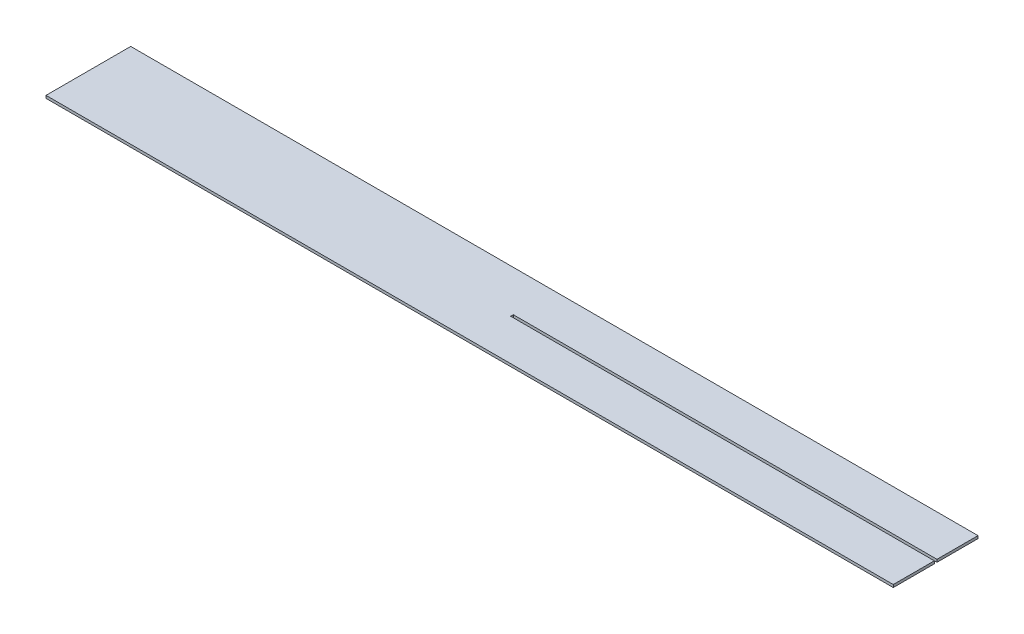
ISO-10303-21;
HEADER;
FILE_DESCRIPTION(('STEP AP214'),'2;1');
FILE_NAME('part.step','',(''),(''),'','','');
FILE_SCHEMA(('AUTOMOTIVE_DESIGN { 1 0 10303 214 1 1 1 1 }'));
ENDSEC;
DATA;
#1=APPLICATION_CONTEXT('core data for automotive mechanical design processes');
#2=APPLICATION_PROTOCOL_DEFINITION('international standard','automotive_design',2000,#1);
#3=PRODUCT_CONTEXT('',#1,'mechanical');
#4=PRODUCT('Part','Part','',(#3));
#5=PRODUCT_RELATED_PRODUCT_CATEGORY('part','',(#4));
#6=PRODUCT_DEFINITION_FORMATION('','',#4);
#7=PRODUCT_DEFINITION_CONTEXT('part definition',#1,'design');
#8=PRODUCT_DEFINITION('design','',#6,#7);
#9=PRODUCT_DEFINITION_SHAPE('','',#8);
#10=(LENGTH_UNIT() NAMED_UNIT(*) SI_UNIT(.MILLI.,.METRE.));
#11=(NAMED_UNIT(*) PLANE_ANGLE_UNIT() SI_UNIT($,.RADIAN.));
#12=(NAMED_UNIT(*) SI_UNIT($,.STERADIAN.) SOLID_ANGLE_UNIT());
#13=UNCERTAINTY_MEASURE_WITH_UNIT(LENGTH_MEASURE(1.E-05),#10,'distance_accuracy_value','');
#14=(GEOMETRIC_REPRESENTATION_CONTEXT(3) GLOBAL_UNCERTAINTY_ASSIGNED_CONTEXT((#13)) GLOBAL_UNIT_ASSIGNED_CONTEXT((#10,
#11,#12)) REPRESENTATION_CONTEXT('',''));
#15=CARTESIAN_POINT('',(0.,0.,0.));
#16=DIRECTION('',(0.,0.,1.));
#17=DIRECTION('',(1.,0.,0.));
#18=AXIS2_PLACEMENT_3D('',#15,#16,#17);
#19=CARTESIAN_POINT('',(0.,1.5875,0.793750000000075));
#20=DIRECTION('',(0.,0.,1.));
#21=DIRECTION('',(1.,0.,0.));
#22=AXIS2_PLACEMENT_3D('',#19,#20,#21);
#23=PLANE('',#22);
#24=DIRECTION('',(-1.,0.,0.));
#25=VECTOR('',#24,1.);
#26=CARTESIAN_POINT('',(0.,0.,0.793750000000075));
#27=LINE('',#26,#25);
#28=CARTESIAN_POINT('',(254.,0.,0.793750000000044));
#29=VERTEX_POINT('',#28);
#30=CARTESIAN_POINT('',(0.,0.,0.793750000000075));
#31=VERTEX_POINT('',#30);
#32=EDGE_CURVE('E136',#29,#31,#27,.T.);
#33=ORIENTED_EDGE('',*,*,#32,.T.);
#34=DIRECTION('',(0.,-1.,0.));
#35=VECTOR('',#34,1.);
#36=CARTESIAN_POINT('',(0.,1.5875,0.793750000000075));
#37=LINE('',#36,#35);
#38=CARTESIAN_POINT('',(0.,1.5875,0.793750000000075));
#39=VERTEX_POINT('',#38);
#40=EDGE_CURVE('E11',#39,#31,#37,.T.);
#41=ORIENTED_EDGE('',*,*,#40,.F.);
#42=DIRECTION('',(-1.,0.,0.));
#43=VECTOR('',#42,1.);
#44=CARTESIAN_POINT('',(0.,1.5875,0.793750000000075));
#45=LINE('',#44,#43);
#46=CARTESIAN_POINT('',(254.,1.5875,0.793750000000044));
#47=VERTEX_POINT('',#46);
#48=EDGE_CURVE('E178',#47,#39,#45,.T.);
#49=ORIENTED_EDGE('',*,*,#48,.F.);
#50=DIRECTION('',(0.,-1.,0.));
#51=VECTOR('',#50,1.);
#52=CARTESIAN_POINT('',(254.,1.5875,0.793750000000044));
#53=LINE('',#52,#51);
#54=EDGE_CURVE('E153',#47,#29,#53,.T.);
#55=ORIENTED_EDGE('',*,*,#54,.T.);
#56=EDGE_LOOP('',(#33,#41,#49,#55));
#57=FACE_BOUND('',#56,.T.);
#58=ADVANCED_FACE('F41',(#57),#23,.F.);
#59=CARTESIAN_POINT('',(0.,1.5875,0.));
#60=DIRECTION('',(-1.,0.,0.));
#61=DIRECTION('',(0.,0.,1.));
#62=AXIS2_PLACEMENT_3D('',#59,#60,#61);
#63=PLANE('',#62);
#64=DIRECTION('',(0.,0.,-1.));
#65=VECTOR('',#64,1.);
#66=CARTESIAN_POINT('',(0.,0.,0.));
#67=LINE('',#66,#65);
#68=CARTESIAN_POINT('',(0.,0.,-0.793749999999926));
#69=VERTEX_POINT('',#68);
#70=EDGE_CURVE('E139',#31,#69,#67,.T.);
#71=ORIENTED_EDGE('',*,*,#70,.T.);
#72=DIRECTION('',(0.,-1.,0.));
#73=VECTOR('',#72,1.);
#74=CARTESIAN_POINT('',(0.,1.5875,-0.793749999999926));
#75=LINE('',#74,#73);
#76=CARTESIAN_POINT('',(0.,1.5875,-0.793749999999926));
#77=VERTEX_POINT('',#76);
#78=EDGE_CURVE('E49',#77,#69,#75,.T.);
#79=ORIENTED_EDGE('',*,*,#78,.F.);
#80=DIRECTION('',(0.,0.,-1.));
#81=VECTOR('',#80,1.);
#82=CARTESIAN_POINT('',(0.,1.5875,0.));
#83=LINE('',#82,#81);
#84=EDGE_CURVE('E99',#39,#77,#83,.T.);
#85=ORIENTED_EDGE('',*,*,#84,.F.);
#86=ORIENTED_EDGE('',*,*,#40,.T.);
#87=EDGE_LOOP('',(#71,#79,#85,#86));
#88=FACE_BOUND('',#87,.T.);
#89=ADVANCED_FACE('F166',(#88),#63,.F.);
#90=CARTESIAN_POINT('',(0.,1.5875,-0.793749999999926));
#91=DIRECTION('',(0.,0.,1.));
#92=DIRECTION('',(1.,0.,0.));
#93=AXIS2_PLACEMENT_3D('',#90,#91,#92);
#94=PLANE('',#93);
#95=DIRECTION('',(-1.,0.,0.));
#96=VECTOR('',#95,1.);
#97=CARTESIAN_POINT('',(0.,0.,-0.793749999999926));
#98=LINE('',#97,#96);
#99=CARTESIAN_POINT('',(254.,0.,-0.793749999999957));
#100=VERTEX_POINT('',#99);
#101=EDGE_CURVE('E142',#100,#69,#98,.T.);
#102=ORIENTED_EDGE('',*,*,#101,.F.);
#103=DIRECTION('',(0.,-1.,0.));
#104=VECTOR('',#103,1.);
#105=CARTESIAN_POINT('',(254.,1.5875,-0.793749999999957));
#106=LINE('',#105,#104);
#107=CARTESIAN_POINT('',(254.,1.5875,-0.793749999999957));
#108=VERTEX_POINT('',#107);
#109=EDGE_CURVE('E159',#108,#100,#106,.T.);
#110=ORIENTED_EDGE('',*,*,#109,.F.);
#111=DIRECTION('',(-1.,0.,0.));
#112=VECTOR('',#111,1.);
#113=CARTESIAN_POINT('',(0.,1.5875,-0.793749999999926));
#114=LINE('',#113,#112);
#115=EDGE_CURVE('E165',#108,#77,#114,.T.);
#116=ORIENTED_EDGE('',*,*,#115,.T.);
#117=ORIENTED_EDGE('',*,*,#78,.T.);
#118=EDGE_LOOP('',(#102,#110,#116,#117));
#119=FACE_BOUND('',#118,.T.);
#120=ADVANCED_FACE('F163',(#119),#94,.T.);
#121=CARTESIAN_POINT('',(254.,1.5875,0.));
#122=DIRECTION('',(-1.,0.,0.));
#123=DIRECTION('',(0.,0.,1.));
#124=AXIS2_PLACEMENT_3D('',#121,#122,#123);
#125=PLANE('',#124);
#126=DIRECTION('',(0.,0.,-1.));
#127=VECTOR('',#126,1.);
#128=CARTESIAN_POINT('',(254.,0.,0.));
#129=LINE('',#128,#127);
#130=CARTESIAN_POINT('',(254.,0.,-25.4));
#131=VERTEX_POINT('',#130);
#132=EDGE_CURVE('E145',#100,#131,#129,.T.);
#133=ORIENTED_EDGE('',*,*,#132,.T.);
#134=DIRECTION('',(0.,-1.,0.));
#135=VECTOR('',#134,1.);
#136=CARTESIAN_POINT('',(254.,1.5875,-25.4));
#137=LINE('',#136,#135);
#138=CARTESIAN_POINT('',(254.,1.5875,-25.4));
#139=VERTEX_POINT('',#138);
#140=EDGE_CURVE('E157',#139,#131,#137,.T.);
#141=ORIENTED_EDGE('',*,*,#140,.F.);
#142=DIRECTION('',(0.,0.,-1.));
#143=VECTOR('',#142,1.);
#144=CARTESIAN_POINT('',(254.,1.5875,0.));
#145=LINE('',#144,#143);
#146=EDGE_CURVE('E132',#108,#139,#145,.T.);
#147=ORIENTED_EDGE('',*,*,#146,.F.);
#148=ORIENTED_EDGE('',*,*,#109,.T.);
#149=EDGE_LOOP('',(#133,#141,#147,#148));
#150=FACE_BOUND('',#149,.T.);
#151=ADVANCED_FACE('F175',(#150),#125,.F.);
#152=CARTESIAN_POINT('',(0.,1.5875,-25.4));
#153=DIRECTION('',(0.,0.,-1.));
#154=DIRECTION('',(-1.,0.,0.));
#155=AXIS2_PLACEMENT_3D('',#152,#153,#154);
#156=PLANE('',#155);
#157=DIRECTION('',(1.,0.,0.));
#158=VECTOR('',#157,1.);
#159=CARTESIAN_POINT('',(0.,0.,-25.4));
#160=LINE('',#159,#158);
#161=CARTESIAN_POINT('',(-254.,0.,-25.4));
#162=VERTEX_POINT('',#161);
#163=EDGE_CURVE('E148',#162,#131,#160,.T.);
#164=ORIENTED_EDGE('',*,*,#163,.F.);
#165=DIRECTION('',(0.,-1.,0.));
#166=VECTOR('',#165,1.);
#167=CARTESIAN_POINT('',(-254.,1.5875,-25.4));
#168=LINE('',#167,#166);
#169=CARTESIAN_POINT('',(-254.,1.5875,-25.4));
#170=VERTEX_POINT('',#169);
#171=EDGE_CURVE('E121',#170,#162,#168,.T.);
#172=ORIENTED_EDGE('',*,*,#171,.F.);
#173=DIRECTION('',(1.,0.,0.));
#174=VECTOR('',#173,1.);
#175=CARTESIAN_POINT('',(0.,1.5875,-25.4));
#176=LINE('',#175,#174);
#177=EDGE_CURVE('E130',#170,#139,#176,.T.);
#178=ORIENTED_EDGE('',*,*,#177,.T.);
#179=ORIENTED_EDGE('',*,*,#140,.T.);
#180=EDGE_LOOP('',(#164,#172,#178,#179));
#181=FACE_BOUND('',#180,.T.);
#182=ADVANCED_FACE('F194',(#181),#156,.T.);
#183=CARTESIAN_POINT('',(-254.,1.5875,0.));
#184=DIRECTION('',(-1.,0.,0.));
#185=DIRECTION('',(0.,0.,1.));
#186=AXIS2_PLACEMENT_3D('',#183,#184,#185);
#187=PLANE('',#186);
#188=DIRECTION('',(0.,0.,-1.));
#189=VECTOR('',#188,1.);
#190=CARTESIAN_POINT('',(-254.,0.,0.));
#191=LINE('',#190,#189);
#192=CARTESIAN_POINT('',(-254.,0.,25.4));
#193=VERTEX_POINT('',#192);
#194=EDGE_CURVE('E120',#193,#162,#191,.T.);
#195=ORIENTED_EDGE('',*,*,#194,.F.);
#196=DIRECTION('',(0.,-1.,0.));
#197=VECTOR('',#196,1.);
#198=CARTESIAN_POINT('',(-254.,1.5875,25.4));
#199=LINE('',#198,#197);
#200=CARTESIAN_POINT('',(-254.,1.5875,25.4));
#201=VERTEX_POINT('',#200);
#202=EDGE_CURVE('E114',#201,#193,#199,.T.);
#203=ORIENTED_EDGE('',*,*,#202,.F.);
#204=DIRECTION('',(0.,0.,-1.));
#205=VECTOR('',#204,1.);
#206=CARTESIAN_POINT('',(-254.,1.5875,0.));
#207=LINE('',#206,#205);
#208=EDGE_CURVE('E118',#201,#170,#207,.T.);
#209=ORIENTED_EDGE('',*,*,#208,.T.);
#210=ORIENTED_EDGE('',*,*,#171,.T.);
#211=EDGE_LOOP('',(#195,#203,#209,#210));
#212=FACE_BOUND('',#211,.T.);
#213=ADVANCED_FACE('F116',(#212),#187,.T.);
#214=CARTESIAN_POINT('',(0.,1.5875,25.4));
#215=DIRECTION('',(0.,0.,-1.));
#216=DIRECTION('',(-1.,0.,0.));
#217=AXIS2_PLACEMENT_3D('',#214,#215,#216);
#218=PLANE('',#217);
#219=DIRECTION('',(1.,0.,0.));
#220=VECTOR('',#219,1.);
#221=CARTESIAN_POINT('',(0.,0.,25.4));
#222=LINE('',#221,#220);
#223=CARTESIAN_POINT('',(254.,0.,25.4));
#224=VERTEX_POINT('',#223);
#225=EDGE_CURVE('E85',#193,#224,#222,.T.);
#226=ORIENTED_EDGE('',*,*,#225,.T.);
#227=DIRECTION('',(0.,-1.,0.));
#228=VECTOR('',#227,1.);
#229=CARTESIAN_POINT('',(254.,1.5875,25.4));
#230=LINE('',#229,#228);
#231=CARTESIAN_POINT('',(254.,1.5875,25.4));
#232=VERTEX_POINT('',#231);
#233=EDGE_CURVE('E122',#232,#224,#230,.T.);
#234=ORIENTED_EDGE('',*,*,#233,.F.);
#235=DIRECTION('',(1.,0.,0.));
#236=VECTOR('',#235,1.);
#237=CARTESIAN_POINT('',(0.,1.5875,25.4));
#238=LINE('',#237,#236);
#239=EDGE_CURVE('E124',#201,#232,#238,.T.);
#240=ORIENTED_EDGE('',*,*,#239,.F.);
#241=ORIENTED_EDGE('',*,*,#202,.T.);
#242=EDGE_LOOP('',(#226,#234,#240,#241));
#243=FACE_BOUND('',#242,.T.);
#244=ADVANCED_FACE('F125',(#243),#218,.F.);
#245=EDGE_CURVE('E91',#224,#29,#129,.T.);
#246=ORIENTED_EDGE('',*,*,#245,.T.);
#247=ORIENTED_EDGE('',*,*,#54,.F.);
#248=EDGE_CURVE('E57',#232,#47,#145,.T.);
#249=ORIENTED_EDGE('',*,*,#248,.F.);
#250=ORIENTED_EDGE('',*,*,#233,.T.);
#251=EDGE_LOOP('',(#246,#247,#249,#250));
#252=FACE_BOUND('',#251,.T.);
#253=ADVANCED_FACE('F183',(#252),#125,.F.);
#254=CARTESIAN_POINT('',(0.,1.5875,0.));
#255=DIRECTION('',(0.,1.,0.));
#256=DIRECTION('',(0.,0.,1.));
#257=AXIS2_PLACEMENT_3D('',#254,#255,#256);
#258=PLANE('',#257);
#259=ORIENTED_EDGE('',*,*,#48,.T.);
#260=ORIENTED_EDGE('',*,*,#84,.T.);
#261=ORIENTED_EDGE('',*,*,#115,.F.);
#262=ORIENTED_EDGE('',*,*,#146,.T.);
#263=ORIENTED_EDGE('',*,*,#177,.F.);
#264=ORIENTED_EDGE('',*,*,#208,.F.);
#265=ORIENTED_EDGE('',*,*,#239,.T.);
#266=ORIENTED_EDGE('',*,*,#248,.T.);
#267=EDGE_LOOP('',(#259,#260,#261,#262,#263,#264,#265,#266));
#268=FACE_BOUND('',#267,.T.);
#269=ADVANCED_FACE('F128',(#268),#258,.T.);
#270=CARTESIAN_POINT('',(0.,0.,0.));
#271=DIRECTION('',(0.,1.,0.));
#272=DIRECTION('',(0.,0.,1.));
#273=AXIS2_PLACEMENT_3D('',#270,#271,#272);
#274=PLANE('',#273);
#275=ORIENTED_EDGE('',*,*,#32,.F.);
#276=ORIENTED_EDGE('',*,*,#245,.F.);
#277=ORIENTED_EDGE('',*,*,#225,.F.);
#278=ORIENTED_EDGE('',*,*,#194,.T.);
#279=ORIENTED_EDGE('',*,*,#163,.T.);
#280=ORIENTED_EDGE('',*,*,#132,.F.);
#281=ORIENTED_EDGE('',*,*,#101,.T.);
#282=ORIENTED_EDGE('',*,*,#70,.F.);
#283=EDGE_LOOP('',(#275,#276,#277,#278,#279,#280,#281,#282));
#284=FACE_BOUND('',#283,.T.);
#285=ADVANCED_FACE('F171',(#284),#274,.F.);
#286=CLOSED_SHELL('',(#58,#89,#120,#151,#182,#213,#244,#253,#269,#285));
#287=MANIFOLD_SOLID_BREP('B2',#286);
#288=ADVANCED_BREP_SHAPE_REPRESENTATION('',(#18,#287),#14);
#289=SHAPE_DEFINITION_REPRESENTATION(#9,#288);
ENDSEC;
END-ISO-10303-21;
